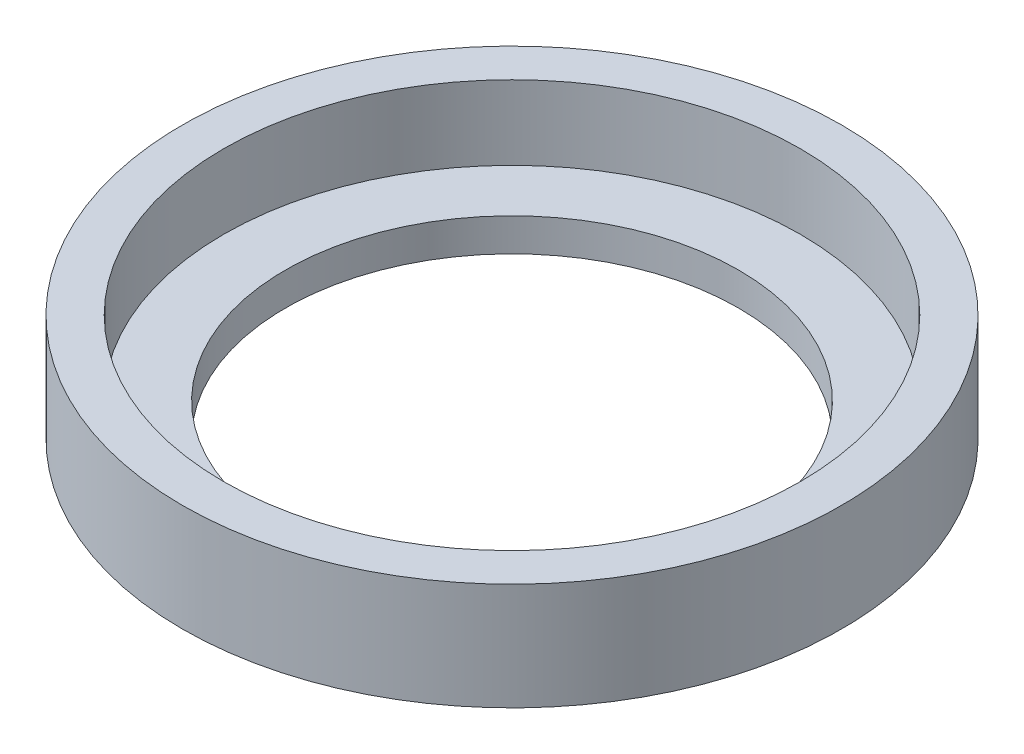
ISO-10303-21;
HEADER;
FILE_DESCRIPTION(('STEP AP214'),'2;1');
FILE_NAME('part.step','',(''),(''),'','','');
FILE_SCHEMA(('AUTOMOTIVE_DESIGN { 1 0 10303 214 1 1 1 1 }'));
ENDSEC;
DATA;
#1=APPLICATION_CONTEXT('core data for automotive mechanical design processes');
#2=APPLICATION_PROTOCOL_DEFINITION('international standard','automotive_design',2000,#1);
#3=PRODUCT_CONTEXT('',#1,'mechanical');
#4=PRODUCT('Part','Part','',(#3));
#5=PRODUCT_RELATED_PRODUCT_CATEGORY('part','',(#4));
#6=PRODUCT_DEFINITION_FORMATION('','',#4);
#7=PRODUCT_DEFINITION_CONTEXT('part definition',#1,'design');
#8=PRODUCT_DEFINITION('design','',#6,#7);
#9=PRODUCT_DEFINITION_SHAPE('','',#8);
#10=(LENGTH_UNIT() NAMED_UNIT(*) SI_UNIT(.MILLI.,.METRE.));
#11=(NAMED_UNIT(*) PLANE_ANGLE_UNIT() SI_UNIT($,.RADIAN.));
#12=(NAMED_UNIT(*) SI_UNIT($,.STERADIAN.) SOLID_ANGLE_UNIT());
#13=UNCERTAINTY_MEASURE_WITH_UNIT(LENGTH_MEASURE(1.E-05),#10,'distance_accuracy_value','');
#14=(GEOMETRIC_REPRESENTATION_CONTEXT(3) GLOBAL_UNCERTAINTY_ASSIGNED_CONTEXT((#13)) GLOBAL_UNIT_ASSIGNED_CONTEXT((#10,
#11,#12)) REPRESENTATION_CONTEXT('',''));
#15=CARTESIAN_POINT('',(0.,0.,0.));
#16=DIRECTION('',(0.,0.,1.));
#17=DIRECTION('',(1.,0.,0.));
#18=AXIS2_PLACEMENT_3D('',#15,#16,#17);
#19=CARTESIAN_POINT('',(0.,9.,0.));
#20=DIRECTION('',(0.,1.,0.));
#21=DIRECTION('',(0.,0.,1.));
#22=AXIS2_PLACEMENT_3D('',#19,#20,#21);
#23=PLANE('',#22);
#24=CARTESIAN_POINT('',(0.,9.,0.));
#25=DIRECTION('',(0.,1.,0.));
#26=DIRECTION('',(0.,0.,1.));
#27=AXIS2_PLACEMENT_3D('',#24,#25,#26);
#28=CIRCLE('',#27,40.);
#29=CARTESIAN_POINT('',(0.,9.,40.));
#30=VERTEX_POINT('',#29);
#31=EDGE_CURVE('E10',#30,#30,#28,.T.);
#32=ORIENTED_EDGE('',*,*,#31,.T.);
#33=EDGE_LOOP('',(#32));
#34=FACE_BOUND('',#33,.T.);
#35=CARTESIAN_POINT('',(0.,9.,0.));
#36=DIRECTION('',(0.,1.,0.));
#37=DIRECTION('',(0.,0.,1.));
#38=AXIS2_PLACEMENT_3D('',#35,#36,#37);
#39=CIRCLE('',#38,35.);
#40=CARTESIAN_POINT('',(0.,9.,35.));
#41=VERTEX_POINT('',#40);
#42=EDGE_CURVE('E38',#41,#41,#39,.T.);
#43=ORIENTED_EDGE('',*,*,#42,.F.);
#44=EDGE_LOOP('',(#43));
#45=FACE_BOUND('',#44,.T.);
#46=ADVANCED_FACE('F31',(#34,#45),#23,.T.);
#47=CARTESIAN_POINT('',(0.,9.,0.));
#48=DIRECTION('',(0.,-1.,0.));
#49=DIRECTION('',(0.,0.,-1.));
#50=AXIS2_PLACEMENT_3D('',#47,#48,#49);
#51=CYLINDRICAL_SURFACE('',#50,40.);
#52=ORIENTED_EDGE('',*,*,#31,.F.);
#53=EDGE_LOOP('',(#52));
#54=FACE_BOUND('',#53,.T.);
#55=CARTESIAN_POINT('',(0.,-4.,0.));
#56=DIRECTION('',(0.,-1.,0.));
#57=DIRECTION('',(0.,0.,-1.));
#58=AXIS2_PLACEMENT_3D('',#55,#56,#57);
#59=CIRCLE('',#58,40.);
#60=CARTESIAN_POINT('',(0.,-4.,-40.));
#61=VERTEX_POINT('',#60);
#62=EDGE_CURVE('E47',#61,#61,#59,.T.);
#63=ORIENTED_EDGE('',*,*,#62,.F.);
#64=EDGE_LOOP('',(#63));
#65=FACE_BOUND('',#64,.T.);
#66=ADVANCED_FACE('F33',(#54,#65),#51,.T.);
#67=CARTESIAN_POINT('',(0.,9.,0.));
#68=DIRECTION('',(0.,-1.,0.));
#69=DIRECTION('',(0.,0.,-1.));
#70=AXIS2_PLACEMENT_3D('',#67,#68,#69);
#71=CYLINDRICAL_SURFACE('',#70,35.);
#72=ORIENTED_EDGE('',*,*,#42,.T.);
#73=EDGE_LOOP('',(#72));
#74=FACE_BOUND('',#73,.T.);
#75=CARTESIAN_POINT('',(0.,0.,0.));
#76=DIRECTION('',(0.,1.,0.));
#77=DIRECTION('',(0.,0.,1.));
#78=AXIS2_PLACEMENT_3D('',#75,#76,#77);
#79=CIRCLE('',#78,35.);
#80=CARTESIAN_POINT('',(0.,0.,35.));
#81=VERTEX_POINT('',#80);
#82=EDGE_CURVE('E42',#81,#81,#79,.T.);
#83=ORIENTED_EDGE('',*,*,#82,.F.);
#84=EDGE_LOOP('',(#83));
#85=FACE_BOUND('',#84,.T.);
#86=ADVANCED_FACE('F71',(#74,#85),#71,.F.);
#87=CARTESIAN_POINT('',(0.,0.,0.));
#88=DIRECTION('',(0.,-1.,0.));
#89=DIRECTION('',(0.,0.,-1.));
#90=AXIS2_PLACEMENT_3D('',#87,#88,#89);
#91=PLANE('',#90);
#92=CARTESIAN_POINT('',(0.,0.,0.));
#93=DIRECTION('',(0.,-1.,0.));
#94=DIRECTION('',(0.,0.,-1.));
#95=AXIS2_PLACEMENT_3D('',#92,#93,#94);
#96=CIRCLE('',#95,27.5);
#97=CARTESIAN_POINT('',(0.,0.,-27.5));
#98=VERTEX_POINT('',#97);
#99=EDGE_CURVE('E52',#98,#98,#96,.T.);
#100=ORIENTED_EDGE('',*,*,#99,.T.);
#101=EDGE_LOOP('',(#100));
#102=FACE_BOUND('',#101,.T.);
#103=ORIENTED_EDGE('',*,*,#82,.T.);
#104=EDGE_LOOP('',(#103));
#105=FACE_BOUND('',#104,.T.);
#106=ADVANCED_FACE('F63',(#102,#105),#91,.F.);
#107=CARTESIAN_POINT('',(0.,-4.,0.));
#108=DIRECTION('',(0.,-1.,0.));
#109=DIRECTION('',(0.,0.,-1.));
#110=AXIS2_PLACEMENT_3D('',#107,#108,#109);
#111=PLANE('',#110);
#112=ORIENTED_EDGE('',*,*,#62,.T.);
#113=EDGE_LOOP('',(#112));
#114=FACE_BOUND('',#113,.T.);
#115=CARTESIAN_POINT('',(0.,-4.,0.));
#116=DIRECTION('',(0.,-1.,0.));
#117=DIRECTION('',(0.,0.,-1.));
#118=AXIS2_PLACEMENT_3D('',#115,#116,#117);
#119=CIRCLE('',#118,27.5);
#120=CARTESIAN_POINT('',(0.,-4.,-27.5));
#121=VERTEX_POINT('',#120);
#122=EDGE_CURVE('E51',#121,#121,#119,.T.);
#123=ORIENTED_EDGE('',*,*,#122,.F.);
#124=EDGE_LOOP('',(#123));
#125=FACE_BOUND('',#124,.T.);
#126=ADVANCED_FACE('F61',(#114,#125),#111,.T.);
#127=CARTESIAN_POINT('',(0.,-4.,0.));
#128=DIRECTION('',(0.,1.,0.));
#129=DIRECTION('',(0.,0.,1.));
#130=AXIS2_PLACEMENT_3D('',#127,#128,#129);
#131=CYLINDRICAL_SURFACE('',#130,27.5);
#132=ORIENTED_EDGE('',*,*,#122,.T.);
#133=EDGE_LOOP('',(#132));
#134=FACE_BOUND('',#133,.T.);
#135=ORIENTED_EDGE('',*,*,#99,.F.);
#136=EDGE_LOOP('',(#135));
#137=FACE_BOUND('',#136,.T.);
#138=ADVANCED_FACE('F58',(#134,#137),#131,.F.);
#139=CLOSED_SHELL('',(#46,#66,#86,#106,#126,#138));
#140=MANIFOLD_SOLID_BREP('B2',#139);
#141=ADVANCED_BREP_SHAPE_REPRESENTATION('',(#18,#140),#14);
#142=SHAPE_DEFINITION_REPRESENTATION(#9,#141);
ENDSEC;
END-ISO-10303-21;
